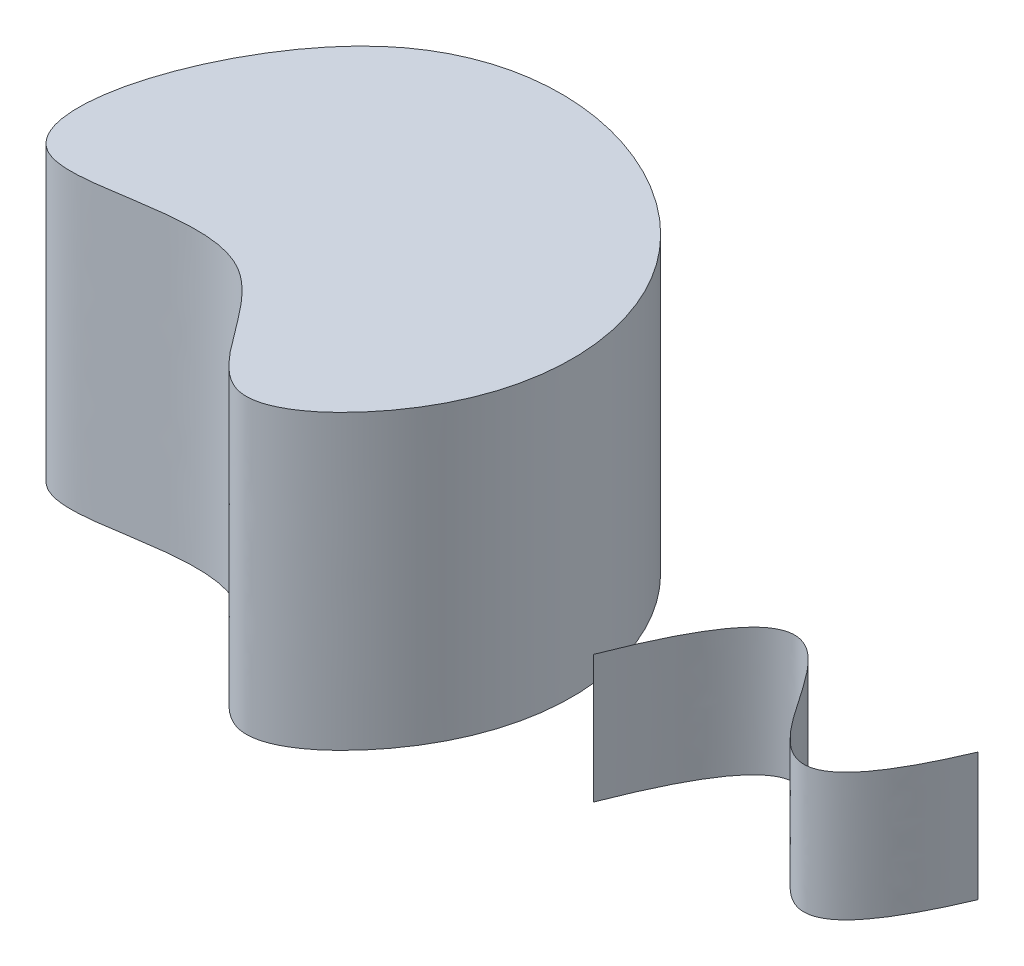
ISO-10303-21;
HEADER;
FILE_DESCRIPTION(('STEP AP214'),'2;1');
FILE_NAME('part.step','',(''),(''),'','','');
FILE_SCHEMA(('AUTOMOTIVE_DESIGN { 1 0 10303 214 1 1 1 1 }'));
ENDSEC;
DATA;
#1=APPLICATION_CONTEXT('core data for automotive mechanical design processes');
#2=APPLICATION_PROTOCOL_DEFINITION('international standard','automotive_design',2000,#1);
#3=PRODUCT_CONTEXT('',#1,'mechanical');
#4=PRODUCT('Part','Part','',(#3));
#5=PRODUCT_RELATED_PRODUCT_CATEGORY('part','',(#4));
#6=PRODUCT_DEFINITION_FORMATION('','',#4);
#7=PRODUCT_DEFINITION_CONTEXT('part definition',#1,'design');
#8=PRODUCT_DEFINITION('design','',#6,#7);
#9=PRODUCT_DEFINITION_SHAPE('','',#8);
#10=(LENGTH_UNIT() NAMED_UNIT(*) SI_UNIT(.MILLI.,.METRE.));
#11=(NAMED_UNIT(*) PLANE_ANGLE_UNIT() SI_UNIT($,.RADIAN.));
#12=(NAMED_UNIT(*) SI_UNIT($,.STERADIAN.) SOLID_ANGLE_UNIT());
#13=UNCERTAINTY_MEASURE_WITH_UNIT(LENGTH_MEASURE(1.E-05),#10,'distance_accuracy_value','');
#14=(GEOMETRIC_REPRESENTATION_CONTEXT(3) GLOBAL_UNCERTAINTY_ASSIGNED_CONTEXT((#13)) GLOBAL_UNIT_ASSIGNED_CONTEXT((#10,
#11,#12)) REPRESENTATION_CONTEXT('',''));
#15=CARTESIAN_POINT('',(0.,0.,0.));
#16=DIRECTION('',(0.,0.,1.));
#17=DIRECTION('',(1.,0.,0.));
#18=AXIS2_PLACEMENT_3D('',#15,#16,#17);
#19=CARTESIAN_POINT('',(-448.170932819804,206.,23.4120281799677));
#20=CARTESIAN_POINT('',(-419.995995788441,206.,37.1373489069883));
#21=CARTESIAN_POINT('',(-301.658596982783,206.,-22.0456714153022));
#22=CARTESIAN_POINT('',(-249.321738252632,206.,139.72663604075));
#23=CARTESIAN_POINT('',(-120.89705334187,206.,23.3127679778798));
#24=CARTESIAN_POINT('',(-142.204306702834,206.,-170.743168755374));
#25=CARTESIAN_POINT('',(-412.463963268361,206.,-241.16908408507));
#26=CARTESIAN_POINT('',(-488.309119651436,206.,3.85885270873328));
#27=CARTESIAN_POINT('',(-448.170932819804,206.,23.4120281799677));
#28=B_SPLINE_CURVE_WITH_KNOTS('',3,(#19,#20,#21,#22,#23,#24,#25,#26,#27),.UNSPECIFIED.,.T.,.F.,
(4,1,1,1,1,1,4),(0.,0.144898228125024,0.26262511008521,0.358553363315416,0.555065391096227,
0.793577102032894,1.),.UNSPECIFIED.);
#29=DIRECTION('',(0.,-1.,0.));
#30=VECTOR('',#29,1.);
#31=SURFACE_OF_LINEAR_EXTRUSION('',#28,#30);
#32=CARTESIAN_POINT('',(-448.170932819804,206.,23.4120281799677));
#33=VERTEX_POINT('',#32);
#34=EDGE_CURVE('E12',#33,#33,#28,.T.);
#35=ORIENTED_EDGE('',*,*,#34,.F.);
#36=EDGE_LOOP('',(#35));
#37=FACE_BOUND('',#36,.T.);
#38=CARTESIAN_POINT('',(-448.170932819804,0.,23.4120281799677));
#39=CARTESIAN_POINT('',(-419.995995788441,0.,37.1373489069883));
#40=CARTESIAN_POINT('',(-301.658596982783,0.,-22.0456714153022));
#41=CARTESIAN_POINT('',(-249.321738252632,0.,139.72663604075));
#42=CARTESIAN_POINT('',(-120.89705334187,0.,23.3127679778798));
#43=CARTESIAN_POINT('',(-142.204306702834,0.,-170.743168755374));
#44=CARTESIAN_POINT('',(-412.463963268361,0.,-241.16908408507));
#45=CARTESIAN_POINT('',(-488.309119651436,0.,3.85885270873328));
#46=CARTESIAN_POINT('',(-448.170932819804,0.,23.4120281799677));
#47=B_SPLINE_CURVE_WITH_KNOTS('',3,(#38,#39,#40,#41,#42,#43,#44,#45,#46),.UNSPECIFIED.,.T.,.F.,
(4,1,1,1,1,1,4),(0.,0.144898228125024,0.26262511008521,0.358553363315416,0.555065391096227,
0.793577102032894,1.),.UNSPECIFIED.);
#48=CARTESIAN_POINT('',(-448.170932819804,0.,23.4120281799677));
#49=VERTEX_POINT('',#48);
#50=EDGE_CURVE('E131',#49,#49,#47,.T.);
#51=ORIENTED_EDGE('',*,*,#50,.T.);
#52=EDGE_LOOP('',(#51));
#53=FACE_BOUND('',#52,.T.);
#54=ADVANCED_FACE('F127',(#37,#53),#31,.F.);
#55=CARTESIAN_POINT('',(-147.534817249527,206.,-86.7886783696323));
#56=DIRECTION('',(0.,1.,0.));
#57=DIRECTION('',(0.,0.,1.));
#58=AXIS2_PLACEMENT_3D('',#55,#56,#57);
#59=PLANE('',#58);
#60=ORIENTED_EDGE('',*,*,#34,.T.);
#61=EDGE_LOOP('',(#60));
#62=FACE_BOUND('',#61,.T.);
#63=ADVANCED_FACE('F150',(#62),#59,.T.);
#64=CARTESIAN_POINT('',(-147.534817249527,0.,-86.7886783696323));
#65=DIRECTION('',(0.,1.,0.));
#66=DIRECTION('',(0.,0.,1.));
#67=AXIS2_PLACEMENT_3D('',#64,#65,#66);
#68=PLANE('',#67);
#69=ORIENTED_EDGE('',*,*,#50,.F.);
#70=EDGE_LOOP('',(#69));
#71=FACE_BOUND('',#70,.T.);
#72=ADVANCED_FACE('F148',(#71),#68,.F.);
#73=CLOSED_SHELL('',(#54,#63,#72));
#74=MANIFOLD_SOLID_BREP('B2',#73);
#75=CARTESIAN_POINT('',(-66.7898260436036,0.,21.4354823310196));
#76=CARTESIAN_POINT('',(26.3244010439925,0.,-217.513818915401));
#77=CARTESIAN_POINT('',(37.2840841408764,0.,160.024354921071));
#78=CARTESIAN_POINT('',(127.959373183342,0.,-54.3729307908789));
#79=B_SPLINE_CURVE_WITH_KNOTS('',3,(#75,#76,#77,#78),.UNSPECIFIED.,.F.,.F.,(4,4),(0.,1.),.UNSPECIFIED.);
#80=DIRECTION('',(0.,1.,0.));
#81=VECTOR('',#80,1.);
#82=SURFACE_OF_LINEAR_EXTRUSION('',#79,#81);
#83=CARTESIAN_POINT('',(-66.7898260436036,90.,21.4354823310196));
#84=CARTESIAN_POINT('',(26.3244010439925,90.,-217.513818915401));
#85=CARTESIAN_POINT('',(37.2840841408764,90.,160.024354921071));
#86=CARTESIAN_POINT('',(127.959373183342,90.,-54.3729307908789));
#87=B_SPLINE_CURVE_WITH_KNOTS('',3,(#83,#84,#85,#86),.UNSPECIFIED.,.F.,.F.,(4,4),(0.,1.),.UNSPECIFIED.);
#88=CARTESIAN_POINT('',(-66.7898260436036,90.,21.4354823310196));
#89=VERTEX_POINT('',#88);
#90=CARTESIAN_POINT('',(127.959373183342,90.,-54.3729307908789));
#91=VERTEX_POINT('',#90);
#92=EDGE_CURVE('E205',#89,#91,#87,.T.);
#93=ORIENTED_EDGE('',*,*,#92,.F.);
#94=DIRECTION('',(0.,1.,0.));
#95=VECTOR('',#94,1.);
#96=CARTESIAN_POINT('',(-66.7898260436036,0.,21.4354823310196));
#97=LINE('',#96,#95);
#98=CARTESIAN_POINT('',(-66.7898260436036,0.,21.4354823310196));
#99=VERTEX_POINT('',#98);
#100=EDGE_CURVE('E187',#99,#89,#97,.T.);
#101=ORIENTED_EDGE('',*,*,#100,.F.);
#102=CARTESIAN_POINT('',(127.959373183342,0.,-54.3729307908789));
#103=VERTEX_POINT('',#102);
#104=EDGE_CURVE('E193',#99,#103,#79,.T.);
#105=ORIENTED_EDGE('',*,*,#104,.T.);
#106=DIRECTION('',(0.,1.,0.));
#107=VECTOR('',#106,1.);
#108=CARTESIAN_POINT('',(127.959373183342,0.,-54.3729307908789));
#109=LINE('',#108,#107);
#110=EDGE_CURVE('E125',#103,#91,#109,.T.);
#111=ORIENTED_EDGE('',*,*,#110,.T.);
#112=EDGE_LOOP('',(#93,#101,#105,#111));
#113=FACE_BOUND('',#112,.T.);
#114=ADVANCED_FACE('F185',(#113),#82,.T.);
#115=OPEN_SHELL('',(#114));
#116=SHELL_BASED_SURFACE_MODEL('B7',(#115));
#117=ADVANCED_BREP_SHAPE_REPRESENTATION('',(#18,#74),#14);
#118=MANIFOLD_SURFACE_SHAPE_REPRESENTATION('',(#18,#116),#14);
#119=SHAPE_REPRESENTATION('',(#18),#14);
#120=SHAPE_DEFINITION_REPRESENTATION(#9,#119);
#121=SHAPE_REPRESENTATION_RELATIONSHIP('','',#119,#117);
#122=SHAPE_REPRESENTATION_RELATIONSHIP('','',#119,#118);
ENDSEC;
END-ISO-10303-21;
